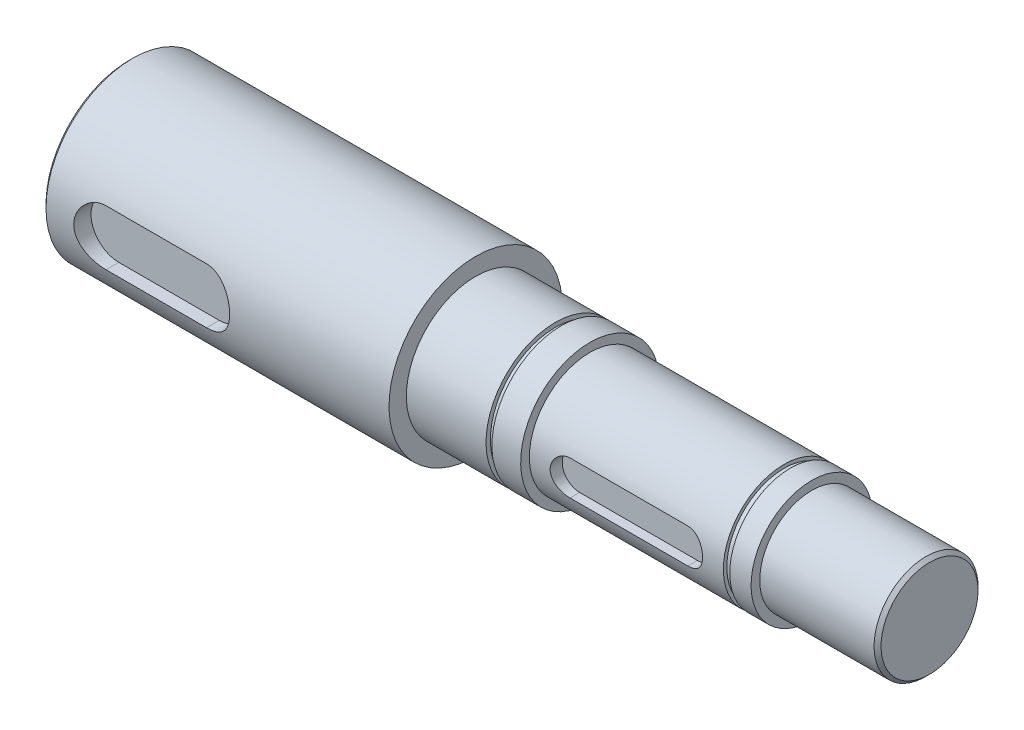
ISO-10303-21;
HEADER;
FILE_DESCRIPTION(('STEP AP214'),'2;1');
FILE_NAME('part.step','',(''),(''),'','','');
FILE_SCHEMA(('AUTOMOTIVE_DESIGN { 1 0 10303 214 1 1 1 1 }'));
ENDSEC;
DATA;
#1=APPLICATION_CONTEXT('core data for automotive mechanical design processes');
#2=APPLICATION_PROTOCOL_DEFINITION('international standard','automotive_design',2000,#1);
#3=PRODUCT_CONTEXT('',#1,'mechanical');
#4=PRODUCT('Part','Part','',(#3));
#5=PRODUCT_RELATED_PRODUCT_CATEGORY('part','',(#4));
#6=PRODUCT_DEFINITION_FORMATION('','',#4);
#7=PRODUCT_DEFINITION_CONTEXT('part definition',#1,'design');
#8=PRODUCT_DEFINITION('design','',#6,#7);
#9=PRODUCT_DEFINITION_SHAPE('','',#8);
#10=(LENGTH_UNIT() NAMED_UNIT(*) SI_UNIT(.MILLI.,.METRE.));
#11=(NAMED_UNIT(*) PLANE_ANGLE_UNIT() SI_UNIT($,.RADIAN.));
#12=(NAMED_UNIT(*) SI_UNIT($,.STERADIAN.) SOLID_ANGLE_UNIT());
#13=UNCERTAINTY_MEASURE_WITH_UNIT(LENGTH_MEASURE(1.E-05),#10,'distance_accuracy_value','');
#14=(GEOMETRIC_REPRESENTATION_CONTEXT(3) GLOBAL_UNCERTAINTY_ASSIGNED_CONTEXT((#13)) GLOBAL_UNIT_ASSIGNED_CONTEXT((#10,
#11,#12)) REPRESENTATION_CONTEXT('',''));
#15=CARTESIAN_POINT('',(0.,0.,0.));
#16=DIRECTION('',(0.,0.,1.));
#17=DIRECTION('',(1.,0.,0.));
#18=AXIS2_PLACEMENT_3D('',#15,#16,#17);
#19=CARTESIAN_POINT('',(231.,0.,0.));
#20=DIRECTION('',(1.,0.,0.));
#21=DIRECTION('',(0.,1.,0.));
#22=AXIS2_PLACEMENT_3D('',#19,#20,#21);
#23=CYLINDRICAL_SURFACE('',#22,17.5);
#24=CARTESIAN_POINT('',(133.,0.,0.));
#25=DIRECTION('',(1.,0.,0.));
#26=DIRECTION('',(0.,1.,0.));
#27=AXIS2_PLACEMENT_3D('',#24,#25,#26);
#28=CIRCLE('',#27,17.5);
#29=CARTESIAN_POINT('',(133.,17.5,0.));
#30=VERTEX_POINT('',#29);
#31=EDGE_CURVE('E188',#30,#30,#28,.T.);
#32=ORIENTED_EDGE('',*,*,#31,.T.);
#33=EDGE_LOOP('',(#32));
#34=FACE_BOUND('',#33,.T.);
#35=CARTESIAN_POINT('',(189.,0.,0.));
#36=DIRECTION('',(1.,0.,0.));
#37=DIRECTION('',(0.,1.,0.));
#38=AXIS2_PLACEMENT_3D('',#35,#36,#37);
#39=CIRCLE('',#38,17.5);
#40=CARTESIAN_POINT('',(189.,17.5,0.));
#41=VERTEX_POINT('',#40);
#42=EDGE_CURVE('E176',#41,#41,#39,.F.);
#43=ORIENTED_EDGE('',*,*,#42,.T.);
#44=EDGE_LOOP('',(#43));
#45=FACE_BOUND('',#44,.T.);
#46=DIRECTION('',(1.,0.,0.));
#47=VECTOR('',#46,1.);
#48=CARTESIAN_POINT('',(231.,-5.,16.7705098312484));
#49=LINE('',#48,#47);
#50=CARTESIAN_POINT('',(178.,-5.,16.7705098312484));
#51=VERTEX_POINT('',#50);
#52=CARTESIAN_POINT('',(144.,-5.,16.7705098312484));
#53=VERTEX_POINT('',#52);
#54=EDGE_CURVE('E58',#51,#53,#49,.F.);
#55=ORIENTED_EDGE('',*,*,#54,.T.);
#56=CARTESIAN_POINT('',(144.,-5.,16.7705098312484));
#57=CARTESIAN_POINT('',(143.862456233053,-5.00001814544053,16.7704912725158));
#58=CARTESIAN_POINT('',(143.724919377977,-4.99432529208164,16.7722013219269));
#59=CARTESIAN_POINT('',(143.450888810716,-4.97165222541634,16.7789431019967));
#60=CARTESIAN_POINT('',(143.314394888157,-4.95467435267923,16.7839741438635));
#61=CARTESIAN_POINT('',(143.043741545981,-4.90961903685605,16.7972068372471));
#62=CARTESIAN_POINT('',(142.909577375167,-4.8815678964473,16.8054009743522));
#63=CARTESIAN_POINT('',(142.644200358011,-4.81461674604718,16.8247046364186));
#64=CARTESIAN_POINT('',(142.512987577578,-4.77571649404059,16.8358142264156));
#65=CARTESIAN_POINT('',(142.254468339378,-4.68740449021954,16.8606149796878));
#66=CARTESIAN_POINT('',(142.127159944636,-4.63799805032665,16.874304837985));
#67=CARTESIAN_POINT('',(141.877200637274,-4.52905522001709,16.9038705765848));
#68=CARTESIAN_POINT('',(141.754551476629,-4.46951506432955,16.9197472690051));
#69=CARTESIAN_POINT('',(141.394791639693,-4.27631278448765,16.9699997678901));
#70=CARTESIAN_POINT('',(141.165701638105,-4.12801150136262,17.007014905076));
#71=CARTESIAN_POINT('',(140.729486035131,-3.79229915782691,17.0850471293107));
#72=CARTESIAN_POINT('',(140.523079725343,-3.60397767000144,17.1261428352533));
#73=CARTESIAN_POINT('',(140.144262306926,-3.19544341696382,17.2070462516998));
#74=CARTESIAN_POINT('',(139.971856835959,-2.97522537348192,17.2468537476932));
#75=CARTESIAN_POINT('',(139.662921908033,-2.50410851659381,17.3215844019062));
#76=CARTESIAN_POINT('',(139.527119075702,-2.25271539483174,17.3564029869974));
#77=CARTESIAN_POINT('',(139.299992287608,-1.72950937060037,17.4163145657262));
#78=CARTESIAN_POINT('',(139.208657694812,-1.45770136944962,17.4414098849257));
#79=CARTESIAN_POINT('',(139.075414299149,-0.908899275051315,17.4784878135792));
#80=CARTESIAN_POINT('',(139.03227814541,-0.632225504452082,17.4907954521753));
#81=CARTESIAN_POINT('',(138.992783305845,-0.0753060921048484,17.5020523750681));
#82=CARTESIAN_POINT('',(138.996416669004,0.204938934421961,17.5010039299558));
#83=CARTESIAN_POINT('',(139.049515480195,0.7524513735302,17.4859002467781));
#84=CARTESIAN_POINT('',(139.097652399274,1.01985970934148,17.4722220494947));
#85=CARTESIAN_POINT('',(139.236240829549,1.5426351469282,17.433846479088));
#86=CARTESIAN_POINT('',(139.326694477011,1.79800164008104,17.4091485496606));
#87=CARTESIAN_POINT('',(139.548266371266,2.29267928834746,17.3509771517082));
#88=CARTESIAN_POINT('',(139.679818952083,2.53178407311226,17.3174105731756));
#89=CARTESIAN_POINT('',(139.979644333576,2.98504901208546,17.245062612945));
#90=CARTESIAN_POINT('',(140.147924587277,3.19920408978385,17.2062801734237));
#91=CARTESIAN_POINT('',(140.427627358825,3.50113424709604,17.1465202223136));
#92=CARTESIAN_POINT('',(140.527363864346,3.60007423743549,17.1259700648702));
#93=CARTESIAN_POINT('',(140.73482024234,3.78923134613089,17.0851123940087));
#94=CARTESIAN_POINT('',(140.84253733987,3.8794514715687,17.0648047990745));
#95=CARTESIAN_POINT('',(141.065345040993,4.05062437518904,17.0249868857383));
#96=CARTESIAN_POINT('',(141.180440529872,4.13157091233146,17.005477109874));
#97=CARTESIAN_POINT('',(141.417160793701,4.28353981460234,16.9678346429649));
#98=CARTESIAN_POINT('',(141.538783003334,4.35456603991597,16.9497014175386));
#99=CARTESIAN_POINT('',(141.788915951318,4.48679157824971,16.9151829895461));
#100=CARTESIAN_POINT('',(141.917478627797,4.54789718496758,16.898814896638));
#101=CARTESIAN_POINT('',(142.17954149636,4.65898872141543,16.8685251216221));
#102=CARTESIAN_POINT('',(142.313039657761,4.70897916633161,16.8546024466244));
#103=CARTESIAN_POINT('',(142.583921011356,4.79739484975373,16.829649854127));
#104=CARTESIAN_POINT('',(142.721299979259,4.835832170633,16.8186169160755));
#105=CARTESIAN_POINT('',(142.998995545652,4.90084834749728,16.7997865631929));
#106=CARTESIAN_POINT('',(143.139310751519,4.92743269748004,16.7919876494692));
#107=CARTESIAN_POINT('',(143.399665114213,4.96528740578586,16.7808301521248));
#108=CARTESIAN_POINT('',(143.519431629728,4.97830600651658,16.776966894118));
#109=CARTESIAN_POINT('',(143.759462294816,4.99566040544727,16.7718034889731));
#110=CARTESIAN_POINT('',(143.879725403777,5.00000944654161,16.7704994326599));
#111=CARTESIAN_POINT('',(144.,5.,16.7705098312484));
#112=B_SPLINE_CURVE_WITH_KNOTS('',3,(#56,#57,#58,#59,#60,#61,#62,#63,#64,#65,#66,#67,#68,#69,
#70,#71,#72,#73,#74,#75,#76,#77,#78,#79,#80,#81,#82,#83,#84,#85,#86,#87,#88,#89,#90,#91,#92,#93,
#94,#95,#96,#97,#98,#99,#100,#101,#102,#103,#104,#105,#106,#107,#108,#109,#110,#111),
.UNSPECIFIED.,.F.,.F.,(4,2,2,2,2,2,2,2,2,2,2,2,2,2,2,2,2,2,2,2,2,2,2,2,2,2,2,4),(0.,
0.41249217880454,0.824898831357961,1.2363317198125,1.64777378699038,2.05900832185037,
2.47039598941261,3.29264569343989,4.13611232627188,4.97971869650209,5.83900986868947,
6.69809539287325,7.53476732988531,8.37129703101928,9.18363381655586,9.99601161556284,
10.8172828992968,11.6387209961027,12.0642579015972,12.489647531354,12.9153217832843,
13.3408299328975,13.7701489130554,14.1992931759112,14.6279870611799,15.056482034464,
15.4177510461265,15.7784677892953),.UNSPECIFIED.);
#113=CARTESIAN_POINT('',(144.,5.,16.7705098312484));
#114=VERTEX_POINT('',#113);
#115=EDGE_CURVE('E12',#53,#114,#112,.T.);
#116=ORIENTED_EDGE('',*,*,#115,.T.);
#117=DIRECTION('',(1.,0.,0.));
#118=VECTOR('',#117,1.);
#119=CARTESIAN_POINT('',(231.,5.,16.7705098312484));
#120=LINE('',#119,#118);
#121=CARTESIAN_POINT('',(178.,5.,16.7705098312484));
#122=VERTEX_POINT('',#121);
#123=EDGE_CURVE('E262',#114,#122,#120,.T.);
#124=ORIENTED_EDGE('',*,*,#123,.T.);
#125=CARTESIAN_POINT('',(178.,5.,16.7705098312484));
#126=CARTESIAN_POINT('',(178.137543766947,5.00001814544053,16.7704912725158));
#127=CARTESIAN_POINT('',(178.275080622023,4.99432529208164,16.7722013219269));
#128=CARTESIAN_POINT('',(178.549111189285,4.97165222541634,16.7789431019967));
#129=CARTESIAN_POINT('',(178.685605111843,4.95467435267923,16.7839741438635));
#130=CARTESIAN_POINT('',(178.95625845402,4.90961903685605,16.7972068372471));
#131=CARTESIAN_POINT('',(179.090422624833,4.88156789644729,16.8054009743522));
#132=CARTESIAN_POINT('',(179.355799641989,4.81461674604718,16.8247046364186));
#133=CARTESIAN_POINT('',(179.487012422422,4.77571649404059,16.8358142264156));
#134=CARTESIAN_POINT('',(179.745531660622,4.68740449021954,16.8606149796878));
#135=CARTESIAN_POINT('',(179.872840055364,4.63799805032665,16.874304837985));
#136=CARTESIAN_POINT('',(180.122799362726,4.52905522001709,16.9038705765848));
#137=CARTESIAN_POINT('',(180.245448523372,4.46951506432955,16.9197472690051));
#138=CARTESIAN_POINT('',(180.605208360307,4.27631278448765,16.9699997678901));
#139=CARTESIAN_POINT('',(180.834298361896,4.12801150136262,17.007014905076));
#140=CARTESIAN_POINT('',(181.270513964869,3.79229915782691,17.0850471293107));
#141=CARTESIAN_POINT('',(181.476920274657,3.60397767000145,17.1261428352533));
#142=CARTESIAN_POINT('',(181.855737693074,3.19544341696383,17.2070462516998));
#143=CARTESIAN_POINT('',(182.028143164041,2.97522537348192,17.2468537476932));
#144=CARTESIAN_POINT('',(182.337078091968,2.5041085165938,17.3215844019062));
#145=CARTESIAN_POINT('',(182.472880924299,2.25271539483174,17.3564029869975));
#146=CARTESIAN_POINT('',(182.700007712392,1.72950937060037,17.4163145657262));
#147=CARTESIAN_POINT('',(182.791342305188,1.45770136944962,17.4414098849257));
#148=CARTESIAN_POINT('',(182.924585700851,0.908899275051315,17.4784878135792));
#149=CARTESIAN_POINT('',(182.96772185459,0.632225504452082,17.4907954521753));
#150=CARTESIAN_POINT('',(183.007216694155,0.075306092104849,17.5020523750681));
#151=CARTESIAN_POINT('',(183.003583330996,-0.20493893442196,17.5010039299558));
#152=CARTESIAN_POINT('',(182.950484519806,-0.752451373530199,17.4859002467781));
#153=CARTESIAN_POINT('',(182.902347600726,-1.01985970934148,17.4722220494947));
#154=CARTESIAN_POINT('',(182.763759170452,-1.5426351469282,17.433846479088));
#155=CARTESIAN_POINT('',(182.67330552299,-1.79800164008104,17.4091485496606));
#156=CARTESIAN_POINT('',(182.451733628734,-2.29267928834746,17.3509771517082));
#157=CARTESIAN_POINT('',(182.320181047918,-2.53178407311225,17.3174105731756));
#158=CARTESIAN_POINT('',(182.020355666425,-2.98504901208545,17.245062612945));
#159=CARTESIAN_POINT('',(181.852075412724,-3.19920408978385,17.2062801734237));
#160=CARTESIAN_POINT('',(181.572372641176,-3.50113424709604,17.1465202223136));
#161=CARTESIAN_POINT('',(181.472636135654,-3.60007423743549,17.1259700648702));
#162=CARTESIAN_POINT('',(181.26517975766,-3.78923134613089,17.0851123940087));
#163=CARTESIAN_POINT('',(181.15746266013,-3.87945147156871,17.0648047990745));
#164=CARTESIAN_POINT('',(180.934654959007,-4.05062437518905,17.0249868857383));
#165=CARTESIAN_POINT('',(180.819559470128,-4.13157091233146,17.005477109874));
#166=CARTESIAN_POINT('',(180.582839206299,-4.28353981460233,16.9678346429649));
#167=CARTESIAN_POINT('',(180.461216996666,-4.35456603991597,16.9497014175386));
#168=CARTESIAN_POINT('',(180.211084048682,-4.48679157824972,16.9151829895461));
#169=CARTESIAN_POINT('',(180.082521372203,-4.54789718496759,16.898814896638));
#170=CARTESIAN_POINT('',(179.82045850364,-4.65898872141544,16.8685251216221));
#171=CARTESIAN_POINT('',(179.686960342239,-4.70897916633162,16.8546024466244));
#172=CARTESIAN_POINT('',(179.416078988644,-4.79739484975373,16.829649854127));
#173=CARTESIAN_POINT('',(179.278700020741,-4.835832170633,16.8186169160755));
#174=CARTESIAN_POINT('',(179.001004454348,-4.90084834749728,16.7997865631929));
#175=CARTESIAN_POINT('',(178.860689248481,-4.92743269748004,16.7919876494692));
#176=CARTESIAN_POINT('',(178.600334885788,-4.96528740578587,16.7808301521248));
#177=CARTESIAN_POINT('',(178.480568370272,-4.97830600651658,16.776966894118));
#178=CARTESIAN_POINT('',(178.240537705184,-4.99566040544728,16.7718034889731));
#179=CARTESIAN_POINT('',(178.120274596223,-5.00000944654161,16.7704994326599));
#180=CARTESIAN_POINT('',(178.,-5.,16.7705098312484));
#181=B_SPLINE_CURVE_WITH_KNOTS('',3,(#125,#126,#127,#128,#129,#130,#131,#132,#133,#134,#135,
#136,#137,#138,#139,#140,#141,#142,#143,#144,#145,#146,#147,#148,#149,#150,#151,#152,#153,#154,
#155,#156,#157,#158,#159,#160,#161,#162,#163,#164,#165,#166,#167,#168,#169,#170,#171,#172,#173,
#174,#175,#176,#177,#178,#179,#180),.UNSPECIFIED.,.F.,.F.,(4,2,2,2,2,2,2,2,2,2,2,2,2,2,2,2,2,2,
2,2,2,2,2,2,2,2,2,4),(0.,0.412492178804568,0.824898831357989,1.23633171981253,1.64777378699038,
2.05900832185037,2.47039598941261,3.29264569343989,4.13611232627187,4.97971869650209,
5.83900986868947,6.69809539287325,7.53476732988531,8.37129703101928,9.18363381655586,
9.99601161556284,10.8172828992967,11.6387209961027,12.0642579015972,12.489647531354,
12.9153217832843,13.3408299328975,13.7701489130554,14.1992931759112,14.6279870611799,
15.056482034464,15.4177510461265,15.7784677892953),.UNSPECIFIED.);
#182=EDGE_CURVE('E265',#122,#51,#181,.T.);
#183=ORIENTED_EDGE('',*,*,#182,.T.);
#184=EDGE_LOOP('',(#55,#116,#124,#183));
#185=FACE_BOUND('',#184,.T.);
#186=ADVANCED_FACE('F43',(#34,#45,#185),#23,.T.);
#187=CARTESIAN_POINT('',(231.,0.,0.));
#188=DIRECTION('',(1.,0.,0.));
#189=DIRECTION('',(0.,1.,0.));
#190=AXIS2_PLACEMENT_3D('',#187,#188,#189);
#191=CYLINDRICAL_SURFACE('',#190,25.);
#192=CARTESIAN_POINT('',(1.,0.,0.));
#193=DIRECTION('',(-1.,0.,0.));
#194=DIRECTION('',(0.,-1.,0.));
#195=AXIS2_PLACEMENT_3D('',#192,#193,#194);
#196=CIRCLE('',#195,25.);
#197=CARTESIAN_POINT('',(1.,-25.,0.));
#198=VERTEX_POINT('',#197);
#199=EDGE_CURVE('E200',#198,#198,#196,.F.);
#200=ORIENTED_EDGE('',*,*,#199,.T.);
#201=EDGE_LOOP('',(#200));
#202=FACE_BOUND('',#201,.T.);
#203=CARTESIAN_POINT('',(100.,0.,0.));
#204=DIRECTION('',(1.,0.,0.));
#205=DIRECTION('',(0.,1.,0.));
#206=AXIS2_PLACEMENT_3D('',#203,#204,#205);
#207=CIRCLE('',#206,25.);
#208=CARTESIAN_POINT('',(100.,25.,0.));
#209=VERTEX_POINT('',#208);
#210=EDGE_CURVE('E197',#209,#209,#207,.T.);
#211=ORIENTED_EDGE('',*,*,#210,.F.);
#212=EDGE_LOOP('',(#211));
#213=FACE_BOUND('',#212,.T.);
#214=DIRECTION('',(1.,0.,0.));
#215=VECTOR('',#214,1.);
#216=CARTESIAN_POINT('',(231.,8.,23.685438564654));
#217=LINE('',#216,#215);
#218=CARTESIAN_POINT('',(17.,8.,23.685438564654));
#219=VERTEX_POINT('',#218);
#220=CARTESIAN_POINT('',(46.,7.99999999999999,23.685438564654));
#221=VERTEX_POINT('',#220);
#222=EDGE_CURVE('E259',#219,#221,#217,.T.);
#223=ORIENTED_EDGE('',*,*,#222,.T.);
#224=CARTESIAN_POINT('',(46.,8.,23.685438564654));
#225=CARTESIAN_POINT('',(46.218795539162,8.0000305009868,23.6854045017699));
#226=CARTESIAN_POINT('',(46.4375784175901,7.99102549590207,23.688469123957));
#227=CARTESIAN_POINT('',(46.8734584831461,7.95517098834654,23.7005466659397));
#228=CARTESIAN_POINT('',(47.0905560797659,7.92832596730078,23.7095580918898));
#229=CARTESIAN_POINT('',(47.5209180700088,7.85711678617779,23.7332474487131));
#230=CARTESIAN_POINT('',(47.7341914372507,7.81280150402691,23.7479095676547));
#231=CARTESIAN_POINT('',(48.156025231161,7.70706364591999,23.7824363785492));
#232=CARTESIAN_POINT('',(48.3645855069398,7.64564052309331,23.8023012368121));
#233=CARTESIAN_POINT('',(48.7754306308973,7.50626477359767,23.8466207436467));
#234=CARTESIAN_POINT('',(48.9777198595615,7.42832399741401,23.871072100227));
#235=CARTESIAN_POINT('',(49.3749573542057,7.25648080977818,23.9238701821779));
#236=CARTESIAN_POINT('',(49.5699028602967,7.16257246913871,23.9522183537893));
#237=CARTESIAN_POINT('',(49.9512127188175,6.9594960920567,24.0120097704205));
#238=CARTESIAN_POINT('',(50.1375757832142,6.85032577498936,24.0434534778038));
#239=CARTESIAN_POINT('',(50.5006602918151,6.61744603477566,24.1085882492257));
#240=CARTESIAN_POINT('',(50.6773782438757,6.49373139612585,24.1422801175567));
#241=CARTESIAN_POINT('',(51.0256325986393,6.22836076648435,24.2121239184413));
#242=CARTESIAN_POINT('',(51.1968168331965,6.08625407883805,24.2483201681044));
#243=CARTESIAN_POINT('',(51.5267130516151,5.78833672714892,24.3211568024613));
#244=CARTESIAN_POINT('',(51.6854248130941,5.6325258188669,24.3577971950608));
#245=CARTESIAN_POINT('',(51.9894414972978,5.30810929270467,24.4305467351509));
#246=CARTESIAN_POINT('',(52.1347417407466,5.13949924631991,24.4666556935584));
#247=CARTESIAN_POINT('',(52.4108811662342,4.79062390909333,24.5373508174071));
#248=CARTESIAN_POINT('',(52.5417253747909,4.61036270425929,24.571937509624));
#249=CARTESIAN_POINT('',(52.7911067782064,4.23472722433445,24.6394880403333));
#250=CARTESIAN_POINT('',(52.9092679746819,4.03909225448966,24.6723920777703));
#251=CARTESIAN_POINT('',(53.1285809303382,3.63806855716319,24.7347045975399));
#252=CARTESIAN_POINT('',(53.2297389430681,3.43268345145265,24.764114363848));
#253=CARTESIAN_POINT('',(53.4142534832096,3.01351588007871,24.8186095857731));
#254=CARTESIAN_POINT('',(53.4976106399432,2.79973371159709,24.8436951942581));
#255=CARTESIAN_POINT('',(53.6457786275789,2.3653182235479,24.8888116650216));
#256=CARTESIAN_POINT('',(53.7105901870623,2.14468517350128,24.9088427258691));
#257=CARTESIAN_POINT('',(53.8192705220839,1.70544225179378,24.9427025935344));
#258=CARTESIAN_POINT('',(53.8637471662537,1.48699651153127,24.9567105519711));
#259=CARTESIAN_POINT('',(53.9343382460007,1.04687351423021,24.9790431991589));
#260=CARTESIAN_POINT('',(53.9604533538181,0.825196375800789,24.987368095974));
#261=CARTESIAN_POINT('',(53.9940664724529,0.380331357109013,24.9980968202581));
#262=CARTESIAN_POINT('',(54.0015677704998,0.157143750579833,25.0005016932125));
#263=CARTESIAN_POINT('',(53.9978884177329,-0.289059181581599,24.9993242896769));
#264=CARTESIAN_POINT('',(53.9867081618934,-0.512074510756486,24.9957421397673));
#265=CARTESIAN_POINT('',(53.9465240781012,-0.948122721994496,24.982932199242));
#266=CARTESIAN_POINT('',(53.918184152377,-1.16122337440047,24.9739147546529));
#267=CARTESIAN_POINT('',(53.8445055714175,-1.5842479286718,24.9506522172205));
#268=CARTESIAN_POINT('',(53.7991612547153,-1.79417074826053,24.9364053833303));
#269=CARTESIAN_POINT('',(53.6918858435822,-2.20926025571511,24.9030623126186));
#270=CARTESIAN_POINT('',(53.6299602872914,-2.41442850679349,24.883967695069));
#271=CARTESIAN_POINT('',(53.4900005454034,-2.8188099194413,24.8414102882546));
#272=CARTESIAN_POINT('',(53.4119602892948,-3.01802080436251,24.8179458531793));
#273=CARTESIAN_POINT('',(53.2393438759578,-3.41154318330595,24.7669380612143));
#274=CARTESIAN_POINT('',(53.1445775213702,-3.60576520425745,24.7393484159813));
#275=CARTESIAN_POINT('',(52.9398473002552,-3.98560999732482,24.6810018717145));
#276=CARTESIAN_POINT('',(52.8298782267942,-4.17122979396889,24.6502438884484));
#277=CARTESIAN_POINT('',(52.5955258992301,-4.53270747909882,24.5863428737413));
#278=CARTESIAN_POINT('',(52.471142139346,-4.7085650247274,24.5531997586266));
#279=CARTESIAN_POINT('',(52.2087683555239,-5.04950188641516,24.4853578278308));
#280=CARTESIAN_POINT('',(52.0707778772517,-5.21458084226651,24.4506589602235));
#281=CARTESIAN_POINT('',(51.7757186660706,-5.53998133884013,24.3790394135533));
#282=CARTESIAN_POINT('',(51.6180796112611,-5.69977939936891,24.3420879194303));
#283=CARTESIAN_POINT('',(51.2899580506973,-6.00554906117101,24.2684591422018));
#284=CARTESIAN_POINT('',(51.1194796287876,-6.15152502579989,24.2317817759498));
#285=CARTESIAN_POINT('',(50.7665715934411,-6.42885617891019,24.1596845061705));
#286=CARTESIAN_POINT('',(50.5841339157041,-6.56020133712787,24.124265476498));
#287=CARTESIAN_POINT('',(50.2086200944304,-6.80720218507682,24.0557358007469));
#288=CARTESIAN_POINT('',(50.0155481375019,-6.92286398797542,24.0226242577006));
#289=CARTESIAN_POINT('',(49.6173089688444,-7.13912382113364,23.9592525423358));
#290=CARTESIAN_POINT('',(49.4120156716435,-7.23950267807823,23.929035814194));
#291=CARTESIAN_POINT('',(48.9931767305922,-7.42247230148351,23.8729148751205));
#292=CARTESIAN_POINT('',(48.7796345405165,-7.50507041945903,23.8470088829081));
#293=CARTESIAN_POINT('',(48.3459770294644,-7.65171374146477,23.8003613895494));
#294=CARTESIAN_POINT('',(48.1258690323962,-7.71577882321283,23.7796143585091));
#295=CARTESIAN_POINT('',(47.6806086982161,-7.82483658602114,23.7439510877628));
#296=CARTESIAN_POINT('',(47.4554587236219,-7.86983801069008,23.7290321752161));
#297=CARTESIAN_POINT('',(47.0255217489757,-7.93665798185134,23.7067632378289));
#298=CARTESIAN_POINT('',(46.8210652886768,-7.96040759697896,23.698785219734));
#299=CARTESIAN_POINT('',(46.4110777238327,-7.99207883674137,23.6881135732448));
#300=CARTESIAN_POINT('',(46.2055484834027,-8.00002217927726,23.6854126941265));
#301=CARTESIAN_POINT('',(46.,-8.,23.685438564654));
#302=B_SPLINE_CURVE_WITH_KNOTS('',3,(#224,#225,#226,#227,#228,#229,#230,#231,#232,#233,#234,
#235,#236,#237,#238,#239,#240,#241,#242,#243,#244,#245,#246,#247,#248,#249,#250,#251,#252,#253,
#254,#255,#256,#257,#258,#259,#260,#261,#262,#263,#264,#265,#266,#267,#268,#269,#270,#271,#272,
#273,#274,#275,#276,#277,#278,#279,#280,#281,#282,#283,#284,#285,#286,#287,#288,#289,#290,#291,
#292,#293,#294,#295,#296,#297,#298,#299,#300,#301),.UNSPECIFIED.,.F.,.F.,(4,2,2,2,2,2,2,2,2,2,2,
2,2,2,2,2,2,2,2,2,2,2,2,2,2,2,2,2,2,2,2,2,2,2,2,2,2,2,4),(0.,0.656160353985757,1.3121559422847,
1.96632907877123,2.62052312901079,3.27424941125305,3.92821897194336,4.58228636115631,
5.23658901442488,5.9120428276018,6.58750868128337,7.26320932101097,7.93867426802346,
8.63054127837651,9.32215326962852,10.0137408059466,10.705301168864,11.3745639939787,
12.0438023152132,12.7129224394405,13.3820284169931,14.0267677786013,14.6717219915366,
15.3164610576552,15.9614434456781,16.6142979195937,17.2673765528145,17.920478108135,
18.5736014781847,19.2552776237621,19.9367378555117,20.6186624291756,21.3003204287233,
21.9909830333727,22.6813595301151,23.3709927905347,24.0603094050433,24.6775982031612,
25.2940382559757),.UNSPECIFIED.);
#303=CARTESIAN_POINT('',(46.,-8.,23.685438564654));
#304=VERTEX_POINT('',#303);
#305=EDGE_CURVE('E73',#221,#304,#302,.T.);
#306=ORIENTED_EDGE('',*,*,#305,.T.);
#307=DIRECTION('',(1.,0.,0.));
#308=VECTOR('',#307,1.);
#309=CARTESIAN_POINT('',(231.,-8.,23.685438564654));
#310=LINE('',#309,#308);
#311=CARTESIAN_POINT('',(17.,-8.,23.685438564654));
#312=VERTEX_POINT('',#311);
#313=EDGE_CURVE('E227',#304,#312,#310,.F.);
#314=ORIENTED_EDGE('',*,*,#313,.T.);
#315=CARTESIAN_POINT('',(17.,-8.,23.685438564654));
#316=CARTESIAN_POINT('',(16.781204460838,-8.0000305009868,23.6854045017699));
#317=CARTESIAN_POINT('',(16.5624215824099,-7.99102549590207,23.688469123957));
#318=CARTESIAN_POINT('',(16.1265415168539,-7.95517098834654,23.7005466659397));
#319=CARTESIAN_POINT('',(15.9094439202341,-7.92832596730078,23.7095580918898));
#320=CARTESIAN_POINT('',(15.4790819299912,-7.85711678617779,23.7332474487131));
#321=CARTESIAN_POINT('',(15.2658085627493,-7.81280150402691,23.7479095676547));
#322=CARTESIAN_POINT('',(14.843974768839,-7.70706364591999,23.7824363785492));
#323=CARTESIAN_POINT('',(14.6354144930602,-7.64564052309331,23.8023012368121));
#324=CARTESIAN_POINT('',(14.2245693691027,-7.50626477359767,23.8466207436467));
#325=CARTESIAN_POINT('',(14.0222801404385,-7.42832399741401,23.871072100227));
#326=CARTESIAN_POINT('',(13.6250426457943,-7.25648080977818,23.9238701821779));
#327=CARTESIAN_POINT('',(13.4300971397033,-7.16257246913871,23.9522183537893));
#328=CARTESIAN_POINT('',(13.0487872811825,-6.9594960920567,24.0120097704205));
#329=CARTESIAN_POINT('',(12.8624242167857,-6.85032577498935,24.0434534778038));
#330=CARTESIAN_POINT('',(12.4993397081849,-6.61744603477566,24.1085882492257));
#331=CARTESIAN_POINT('',(12.3226217561243,-6.49373139612585,24.1422801175567));
#332=CARTESIAN_POINT('',(11.9743674013607,-6.22836076648434,24.2121239184413));
#333=CARTESIAN_POINT('',(11.8031831668034,-6.08625407883805,24.2483201681044));
#334=CARTESIAN_POINT('',(11.4732869483849,-5.78833672714892,24.3211568024613));
#335=CARTESIAN_POINT('',(11.3145751869059,-5.6325258188669,24.3577971950608));
#336=CARTESIAN_POINT('',(11.0105585027022,-5.30810929270467,24.4305467351509));
#337=CARTESIAN_POINT('',(10.8652582592534,-5.13949924631991,24.4666556935584));
#338=CARTESIAN_POINT('',(10.5891188337658,-4.79062390909333,24.5373508174071));
#339=CARTESIAN_POINT('',(10.4582746252091,-4.61036270425929,24.5719375096239));
#340=CARTESIAN_POINT('',(10.2088932217936,-4.23472722433445,24.6394880403333));
#341=CARTESIAN_POINT('',(10.0907320253181,-4.03909225448966,24.6723920777703));
#342=CARTESIAN_POINT('',(9.87141906966182,-3.63806855716319,24.7347045975399));
#343=CARTESIAN_POINT('',(9.77026105693185,-3.43268345145265,24.764114363848));
#344=CARTESIAN_POINT('',(9.58574651679038,-3.01351588007871,24.8186095857731));
#345=CARTESIAN_POINT('',(9.50238936005683,-2.79973371159709,24.8436951942581));
#346=CARTESIAN_POINT('',(9.35422137242115,-2.3653182235479,24.8888116650216));
#347=CARTESIAN_POINT('',(9.2894098129377,-2.14468517350128,24.9088427258691));
#348=CARTESIAN_POINT('',(9.18072947791608,-1.70544225179378,24.9427025935344));
#349=CARTESIAN_POINT('',(9.13625283374629,-1.48699651153126,24.9567105519711));
#350=CARTESIAN_POINT('',(9.06566175399934,-1.0468735142302,24.9790431991589));
#351=CARTESIAN_POINT('',(9.03954664618187,-0.825196375800787,24.987368095974));
#352=CARTESIAN_POINT('',(9.00593352754705,-0.38033135710901,24.9980968202581));
#353=CARTESIAN_POINT('',(8.99843222950016,-0.15714375057983,25.0005016932125));
#354=CARTESIAN_POINT('',(9.00211158226705,0.289059181581603,24.9993242896769));
#355=CARTESIAN_POINT('',(9.0132918381066,0.51207451075649,24.9957421397673));
#356=CARTESIAN_POINT('',(9.0534759218988,0.9481227219945,24.982932199242));
#357=CARTESIAN_POINT('',(9.08181584762303,1.16122337440048,24.9739147546529));
#358=CARTESIAN_POINT('',(9.15549442858252,1.58424792867181,24.9506522172205));
#359=CARTESIAN_POINT('',(9.20083874528467,1.79417074826054,24.9364053833303));
#360=CARTESIAN_POINT('',(9.30811415641775,2.20926025571512,24.9030623126186));
#361=CARTESIAN_POINT('',(9.37003971270861,2.41442850679349,24.883967695069));
#362=CARTESIAN_POINT('',(9.50999945459665,2.81880991944131,24.8414102882546));
#363=CARTESIAN_POINT('',(9.58803971070517,3.01802080436252,24.8179458531793));
#364=CARTESIAN_POINT('',(9.76065612404218,3.41154318330595,24.7669380612143));
#365=CARTESIAN_POINT('',(9.85542247862979,3.60576520425745,24.7393484159813));
#366=CARTESIAN_POINT('',(10.0601526997448,3.98560999732482,24.6810018717145));
#367=CARTESIAN_POINT('',(10.1701217732058,4.17122979396889,24.6502438884484));
#368=CARTESIAN_POINT('',(10.4044741007699,4.53270747909883,24.5863428737413));
#369=CARTESIAN_POINT('',(10.528857860654,4.7085650247274,24.5531997586266));
#370=CARTESIAN_POINT('',(10.7912316444761,5.04950188641516,24.4853578278308));
#371=CARTESIAN_POINT('',(10.9292221227483,5.21458084226652,24.4506589602235));
#372=CARTESIAN_POINT('',(11.2242813339294,5.53998133884013,24.3790394135533));
#373=CARTESIAN_POINT('',(11.381920388739,5.69977939936891,24.3420879194303));
#374=CARTESIAN_POINT('',(11.7100419493027,6.00554906117101,24.2684591422018));
#375=CARTESIAN_POINT('',(11.8805203712124,6.15152502579989,24.2317817759498));
#376=CARTESIAN_POINT('',(12.2334284065589,6.42885617891019,24.1596845061705));
#377=CARTESIAN_POINT('',(12.4158660842959,6.56020133712788,24.124265476498));
#378=CARTESIAN_POINT('',(12.7913799055696,6.80720218507683,24.0557358007469));
#379=CARTESIAN_POINT('',(12.9844518624981,6.92286398797542,24.0226242577006));
#380=CARTESIAN_POINT('',(13.3826910311556,7.13912382113364,23.9592525423358));
#381=CARTESIAN_POINT('',(13.5879843283565,7.23950267807823,23.929035814194));
#382=CARTESIAN_POINT('',(14.0068232694078,7.42247230148351,23.8729148751205));
#383=CARTESIAN_POINT('',(14.2203654594835,7.50507041945903,23.8470088829081));
#384=CARTESIAN_POINT('',(14.6540229705356,7.65171374146477,23.8003613895494));
#385=CARTESIAN_POINT('',(14.8741309676038,7.71577882321283,23.7796143585091));
#386=CARTESIAN_POINT('',(15.3193913017839,7.82483658602114,23.7439510877628));
#387=CARTESIAN_POINT('',(15.5445412763781,7.86983801069008,23.7290321752161));
#388=CARTESIAN_POINT('',(15.9744782510243,7.93665798185134,23.7067632378289));
#389=CARTESIAN_POINT('',(16.1789347113232,7.96040759697896,23.698785219734));
#390=CARTESIAN_POINT('',(16.5889222761673,7.99207883674137,23.6881135732448));
#391=CARTESIAN_POINT('',(16.7944515165973,8.00002217927726,23.6854126941265));
#392=CARTESIAN_POINT('',(17.,8.,23.685438564654));
#393=B_SPLINE_CURVE_WITH_KNOTS('',3,(#315,#316,#317,#318,#319,#320,#321,#322,#323,#324,#325,
#326,#327,#328,#329,#330,#331,#332,#333,#334,#335,#336,#337,#338,#339,#340,#341,#342,#343,#344,
#345,#346,#347,#348,#349,#350,#351,#352,#353,#354,#355,#356,#357,#358,#359,#360,#361,#362,#363,
#364,#365,#366,#367,#368,#369,#370,#371,#372,#373,#374,#375,#376,#377,#378,#379,#380,#381,#382,
#383,#384,#385,#386,#387,#388,#389,#390,#391,#392),.UNSPECIFIED.,.F.,.F.,(4,2,2,2,2,2,2,2,2,2,2,
2,2,2,2,2,2,2,2,2,2,2,2,2,2,2,2,2,2,2,2,2,2,2,2,2,2,2,4),(0.,0.656160353985757,1.3121559422847,
1.96632907877124,2.6205231290108,3.27424941125305,3.92821897194338,4.58228636115631,
5.23658901442489,5.91204282760181,6.58750868128337,7.26320932101097,7.93867426802346,
8.63054127837651,9.32215326962852,10.0137408059466,10.705301168864,11.3745639939787,
12.0438023152132,12.7129224394405,13.3820284169931,14.0267677786013,14.6717219915366,
15.3164610576552,15.9614434456781,16.6142979195937,17.2673765528145,17.920478108135,
18.5736014781847,19.2552776237621,19.9367378555117,20.6186624291756,21.3003204287233,
21.9909830333727,22.6813595301151,23.3709927905347,24.0603094050433,24.6775982031612,
25.2940382559757),.UNSPECIFIED.);
#394=EDGE_CURVE('E252',#312,#219,#393,.T.);
#395=ORIENTED_EDGE('',*,*,#394,.T.);
#396=EDGE_LOOP('',(#223,#306,#314,#395));
#397=FACE_BOUND('',#396,.T.);
#398=ADVANCED_FACE('F229',(#202,#213,#397),#191,.T.);
#399=CARTESIAN_POINT('',(231.,0.,0.));
#400=DIRECTION('',(1.,0.,0.));
#401=DIRECTION('',(0.,1.,0.));
#402=AXIS2_PLACEMENT_3D('',#399,#400,#401);
#403=CYLINDRICAL_SURFACE('',#402,20.);
#404=CARTESIAN_POINT('',(124.7,0.,0.));
#405=DIRECTION('',(1.,0.,0.));
#406=DIRECTION('',(0.,1.,0.));
#407=AXIS2_PLACEMENT_3D('',#404,#405,#406);
#408=CIRCLE('',#407,20.);
#409=CARTESIAN_POINT('',(124.7,20.,0.));
#410=VERTEX_POINT('',#409);
#411=EDGE_CURVE('E180',#410,#410,#408,.F.);
#412=ORIENTED_EDGE('',*,*,#411,.F.);
#413=EDGE_LOOP('',(#412));
#414=FACE_BOUND('',#413,.T.);
#415=CARTESIAN_POINT('',(133.,0.,0.));
#416=DIRECTION('',(1.,0.,0.));
#417=DIRECTION('',(0.,1.,0.));
#418=AXIS2_PLACEMENT_3D('',#415,#416,#417);
#419=CIRCLE('',#418,20.);
#420=CARTESIAN_POINT('',(133.,20.,0.));
#421=VERTEX_POINT('',#420);
#422=EDGE_CURVE('E191',#421,#421,#419,.T.);
#423=ORIENTED_EDGE('',*,*,#422,.F.);
#424=EDGE_LOOP('',(#423));
#425=FACE_BOUND('',#424,.T.);
#426=ADVANCED_FACE('F299',(#414,#425),#403,.T.);
#427=CARTESIAN_POINT('',(133.,20.,0.));
#428=DIRECTION('',(1.,0.,0.));
#429=DIRECTION('',(0.,1.,0.));
#430=AXIS2_PLACEMENT_3D('',#427,#428,#429);
#431=PLANE('',#430);
#432=ORIENTED_EDGE('',*,*,#422,.T.);
#433=EDGE_LOOP('',(#432));
#434=FACE_BOUND('',#433,.T.);
#435=ORIENTED_EDGE('',*,*,#31,.F.);
#436=EDGE_LOOP('',(#435));
#437=FACE_BOUND('',#436,.T.);
#438=ADVANCED_FACE('F343',(#434,#437),#431,.T.);
#439=CARTESIAN_POINT('',(190.85,0.,0.));
#440=DIRECTION('',(1.,0.,0.));
#441=DIRECTION('',(0.,1.,0.));
#442=AXIS2_PLACEMENT_3D('',#439,#440,#441);
#443=PLANE('',#442);
#444=CARTESIAN_POINT('',(190.85,0.,0.));
#445=DIRECTION('',(1.,0.,0.));
#446=DIRECTION('',(0.,1.,0.));
#447=AXIS2_PLACEMENT_3D('',#444,#445,#446);
#448=CIRCLE('',#447,17.5);
#449=CARTESIAN_POINT('',(190.85,17.5,0.));
#450=VERTEX_POINT('',#449);
#451=EDGE_CURVE('E185',#450,#450,#448,.F.);
#452=ORIENTED_EDGE('',*,*,#451,.T.);
#453=EDGE_LOOP('',(#452));
#454=FACE_BOUND('',#453,.T.);
#455=CARTESIAN_POINT('',(190.85,0.,0.));
#456=DIRECTION('',(1.,0.,0.));
#457=DIRECTION('',(0.,1.,0.));
#458=AXIS2_PLACEMENT_3D('',#455,#456,#457);
#459=CIRCLE('',#458,16.5);
#460=CARTESIAN_POINT('',(190.85,16.5,0.));
#461=VERTEX_POINT('',#460);
#462=EDGE_CURVE('E173',#461,#461,#459,.T.);
#463=ORIENTED_EDGE('',*,*,#462,.T.);
#464=EDGE_LOOP('',(#463));
#465=FACE_BOUND('',#464,.T.);
#466=ADVANCED_FACE('F339',(#454,#465),#443,.F.);
#467=CARTESIAN_POINT('',(189.,0.,0.));
#468=DIRECTION('',(1.,0.,0.));
#469=DIRECTION('',(0.,1.,0.));
#470=AXIS2_PLACEMENT_3D('',#467,#468,#469);
#471=PLANE('',#470);
#472=ORIENTED_EDGE('',*,*,#42,.F.);
#473=EDGE_LOOP('',(#472));
#474=FACE_BOUND('',#473,.T.);
#475=CARTESIAN_POINT('',(189.,0.,0.));
#476=DIRECTION('',(1.,0.,0.));
#477=DIRECTION('',(0.,1.,0.));
#478=AXIS2_PLACEMENT_3D('',#475,#476,#477);
#479=CIRCLE('',#478,16.5);
#480=CARTESIAN_POINT('',(189.,16.5,0.));
#481=VERTEX_POINT('',#480);
#482=EDGE_CURVE('E177',#481,#481,#479,.T.);
#483=ORIENTED_EDGE('',*,*,#482,.F.);
#484=EDGE_LOOP('',(#483));
#485=FACE_BOUND('',#484,.T.);
#486=ADVANCED_FACE('F336',(#474,#485),#471,.T.);
#487=CARTESIAN_POINT('',(190.85,0.,0.));
#488=DIRECTION('',(-1.,0.,0.));
#489=DIRECTION('',(0.,-1.,0.));
#490=AXIS2_PLACEMENT_3D('',#487,#488,#489);
#491=CYLINDRICAL_SURFACE('',#490,16.5);
#492=ORIENTED_EDGE('',*,*,#462,.F.);
#493=EDGE_LOOP('',(#492));
#494=FACE_BOUND('',#493,.T.);
#495=ORIENTED_EDGE('',*,*,#482,.T.);
#496=EDGE_LOOP('',(#495));
#497=FACE_BOUND('',#496,.T.);
#498=ADVANCED_FACE('F334',(#494,#497),#491,.T.);
#499=CARTESIAN_POINT('',(231.,15.,0.));
#500=DIRECTION('',(1.,0.,0.));
#501=DIRECTION('',(0.,1.,0.));
#502=AXIS2_PLACEMENT_3D('',#499,#500,#501);
#503=PLANE('',#502);
#504=CARTESIAN_POINT('',(231.,0.,0.));
#505=DIRECTION('',(1.,0.,0.));
#506=DIRECTION('',(0.,1.,0.));
#507=AXIS2_PLACEMENT_3D('',#504,#505,#506);
#508=CIRCLE('',#507,14.);
#509=CARTESIAN_POINT('',(231.,14.,0.));
#510=VERTEX_POINT('',#509);
#511=EDGE_CURVE('E206',#510,#510,#508,.T.);
#512=ORIENTED_EDGE('',*,*,#511,.T.);
#513=EDGE_LOOP('',(#512));
#514=FACE_BOUND('',#513,.T.);
#515=ADVANCED_FACE('F330',(#514),#503,.T.);
#516=CARTESIAN_POINT('',(231.,0.,0.));
#517=DIRECTION('',(-1.,0.,0.));
#518=DIRECTION('',(0.,-1.,0.));
#519=AXIS2_PLACEMENT_3D('',#516,#517,#518);
#520=CONICAL_SURFACE('',#519,14.,0.785398163397448);
#521=CARTESIAN_POINT('',(230.,0.,0.));
#522=DIRECTION('',(1.,0.,0.));
#523=DIRECTION('',(0.,1.,0.));
#524=AXIS2_PLACEMENT_3D('',#521,#522,#523);
#525=CIRCLE('',#524,15.);
#526=CARTESIAN_POINT('',(230.,15.,0.));
#527=VERTEX_POINT('',#526);
#528=EDGE_CURVE('E209',#527,#527,#525,.F.);
#529=ORIENTED_EDGE('',*,*,#528,.F.);
#530=EDGE_LOOP('',(#529));
#531=FACE_BOUND('',#530,.T.);
#532=ORIENTED_EDGE('',*,*,#511,.F.);
#533=EDGE_LOOP('',(#532));
#534=FACE_BOUND('',#533,.T.);
#535=ADVANCED_FACE('F46',(#531,#534),#520,.T.);
#536=CARTESIAN_POINT('',(231.,0.,0.));
#537=DIRECTION('',(1.,0.,0.));
#538=DIRECTION('',(0.,1.,0.));
#539=AXIS2_PLACEMENT_3D('',#536,#537,#538);
#540=CYLINDRICAL_SURFACE('',#539,15.);
#541=ORIENTED_EDGE('',*,*,#528,.T.);
#542=EDGE_LOOP('',(#541));
#543=FACE_BOUND('',#542,.T.);
#544=CARTESIAN_POINT('',(197.,0.,0.));
#545=DIRECTION('',(1.,0.,0.));
#546=DIRECTION('',(0.,1.,0.));
#547=AXIS2_PLACEMENT_3D('',#544,#545,#546);
#548=CIRCLE('',#547,15.);
#549=CARTESIAN_POINT('',(197.,15.,0.));
#550=VERTEX_POINT('',#549);
#551=EDGE_CURVE('E181',#550,#550,#548,.T.);
#552=ORIENTED_EDGE('',*,*,#551,.T.);
#553=EDGE_LOOP('',(#552));
#554=FACE_BOUND('',#553,.T.);
#555=ADVANCED_FACE('F314',(#543,#554),#540,.T.);
#556=CARTESIAN_POINT('',(197.,17.5,0.));
#557=DIRECTION('',(1.,0.,0.));
#558=DIRECTION('',(0.,1.,0.));
#559=AXIS2_PLACEMENT_3D('',#556,#557,#558);
#560=PLANE('',#559);
#561=CARTESIAN_POINT('',(197.,0.,0.));
#562=DIRECTION('',(1.,0.,0.));
#563=DIRECTION('',(0.,1.,0.));
#564=AXIS2_PLACEMENT_3D('',#561,#562,#563);
#565=CIRCLE('',#564,17.5);
#566=CARTESIAN_POINT('',(197.,17.5,0.));
#567=VERTEX_POINT('',#566);
#568=EDGE_CURVE('E184',#567,#567,#565,.T.);
#569=ORIENTED_EDGE('',*,*,#568,.T.);
#570=EDGE_LOOP('',(#569));
#571=FACE_BOUND('',#570,.T.);
#572=ORIENTED_EDGE('',*,*,#551,.F.);
#573=EDGE_LOOP('',(#572));
#574=FACE_BOUND('',#573,.T.);
#575=ADVANCED_FACE('F304',(#571,#574),#560,.T.);
#576=ORIENTED_EDGE('',*,*,#451,.F.);
#577=EDGE_LOOP('',(#576));
#578=FACE_BOUND('',#577,.T.);
#579=ORIENTED_EDGE('',*,*,#568,.F.);
#580=EDGE_LOOP('',(#579));
#581=FACE_BOUND('',#580,.T.);
#582=ADVANCED_FACE('F272',(#578,#581),#23,.T.);
#583=CARTESIAN_POINT('',(124.7,0.,0.));
#584=DIRECTION('',(1.,0.,0.));
#585=DIRECTION('',(0.,1.,0.));
#586=AXIS2_PLACEMENT_3D('',#583,#584,#585);
#587=PLANE('',#586);
#588=ORIENTED_EDGE('',*,*,#411,.T.);
#589=EDGE_LOOP('',(#588));
#590=FACE_BOUND('',#589,.T.);
#591=CARTESIAN_POINT('',(124.7,0.,0.));
#592=DIRECTION('',(1.,0.,0.));
#593=DIRECTION('',(0.,1.,0.));
#594=AXIS2_PLACEMENT_3D('',#591,#592,#593);
#595=CIRCLE('',#594,18.75);
#596=CARTESIAN_POINT('',(124.7,18.75,0.));
#597=VERTEX_POINT('',#596);
#598=EDGE_CURVE('E167',#597,#597,#595,.T.);
#599=ORIENTED_EDGE('',*,*,#598,.T.);
#600=EDGE_LOOP('',(#599));
#601=FACE_BOUND('',#600,.T.);
#602=ADVANCED_FACE('F303',(#590,#601),#587,.F.);
#603=CARTESIAN_POINT('',(123.,0.,0.));
#604=DIRECTION('',(1.,0.,0.));
#605=DIRECTION('',(0.,1.,0.));
#606=AXIS2_PLACEMENT_3D('',#603,#604,#605);
#607=PLANE('',#606);
#608=CARTESIAN_POINT('',(123.,0.,0.));
#609=DIRECTION('',(1.,0.,0.));
#610=DIRECTION('',(0.,1.,0.));
#611=AXIS2_PLACEMENT_3D('',#608,#609,#610);
#612=CIRCLE('',#611,20.);
#613=CARTESIAN_POINT('',(123.,20.,0.));
#614=VERTEX_POINT('',#613);
#615=EDGE_CURVE('E170',#614,#614,#612,.F.);
#616=ORIENTED_EDGE('',*,*,#615,.F.);
#617=EDGE_LOOP('',(#616));
#618=FACE_BOUND('',#617,.T.);
#619=CARTESIAN_POINT('',(123.,0.,0.));
#620=DIRECTION('',(1.,0.,0.));
#621=DIRECTION('',(0.,1.,0.));
#622=AXIS2_PLACEMENT_3D('',#619,#620,#621);
#623=CIRCLE('',#622,18.75);
#624=CARTESIAN_POINT('',(123.,18.75,0.));
#625=VERTEX_POINT('',#624);
#626=EDGE_CURVE('E166',#625,#625,#623,.T.);
#627=ORIENTED_EDGE('',*,*,#626,.F.);
#628=EDGE_LOOP('',(#627));
#629=FACE_BOUND('',#628,.T.);
#630=ADVANCED_FACE('F311',(#618,#629),#607,.T.);
#631=CARTESIAN_POINT('',(124.7,0.,0.));
#632=DIRECTION('',(-1.,0.,0.));
#633=DIRECTION('',(0.,-1.,0.));
#634=AXIS2_PLACEMENT_3D('',#631,#632,#633);
#635=CYLINDRICAL_SURFACE('',#634,18.75);
#636=ORIENTED_EDGE('',*,*,#598,.F.);
#637=EDGE_LOOP('',(#636));
#638=FACE_BOUND('',#637,.T.);
#639=ORIENTED_EDGE('',*,*,#626,.T.);
#640=EDGE_LOOP('',(#639));
#641=FACE_BOUND('',#640,.T.);
#642=ADVANCED_FACE('F250',(#638,#641),#635,.T.);
#643=CARTESIAN_POINT('',(0.,0.,0.));
#644=DIRECTION('',(-1.,0.,0.));
#645=DIRECTION('',(0.,-1.,0.));
#646=AXIS2_PLACEMENT_3D('',#643,#644,#645);
#647=PLANE('',#646);
#648=CARTESIAN_POINT('',(0.,0.,0.));
#649=DIRECTION('',(-1.,0.,0.));
#650=DIRECTION('',(0.,-1.,0.));
#651=AXIS2_PLACEMENT_3D('',#648,#649,#650);
#652=CIRCLE('',#651,24.);
#653=CARTESIAN_POINT('',(0.,-24.,0.));
#654=VERTEX_POINT('',#653);
#655=EDGE_CURVE('E203',#654,#654,#652,.T.);
#656=ORIENTED_EDGE('',*,*,#655,.T.);
#657=EDGE_LOOP('',(#656));
#658=FACE_BOUND('',#657,.T.);
#659=ADVANCED_FACE('F352',(#658),#647,.T.);
#660=CARTESIAN_POINT('',(1.,0.,0.));
#661=DIRECTION('',(1.,0.,0.));
#662=DIRECTION('',(0.,1.,0.));
#663=AXIS2_PLACEMENT_3D('',#660,#661,#662);
#664=CONICAL_SURFACE('',#663,25.,0.785398163397454);
#665=ORIENTED_EDGE('',*,*,#655,.F.);
#666=EDGE_LOOP('',(#665));
#667=FACE_BOUND('',#666,.T.);
#668=ORIENTED_EDGE('',*,*,#199,.F.);
#669=EDGE_LOOP('',(#668));
#670=FACE_BOUND('',#669,.T.);
#671=ADVANCED_FACE('F366',(#667,#670),#664,.T.);
#672=CARTESIAN_POINT('',(100.,25.,0.));
#673=DIRECTION('',(1.,0.,0.));
#674=DIRECTION('',(0.,1.,0.));
#675=AXIS2_PLACEMENT_3D('',#672,#673,#674);
#676=PLANE('',#675);
#677=ORIENTED_EDGE('',*,*,#210,.T.);
#678=EDGE_LOOP('',(#677));
#679=FACE_BOUND('',#678,.T.);
#680=CARTESIAN_POINT('',(100.,0.,0.));
#681=DIRECTION('',(1.,0.,0.));
#682=DIRECTION('',(0.,1.,0.));
#683=AXIS2_PLACEMENT_3D('',#680,#681,#682);
#684=CIRCLE('',#683,20.);
#685=CARTESIAN_POINT('',(100.,20.,0.));
#686=VERTEX_POINT('',#685);
#687=EDGE_CURVE('E194',#686,#686,#684,.T.);
#688=ORIENTED_EDGE('',*,*,#687,.F.);
#689=EDGE_LOOP('',(#688));
#690=FACE_BOUND('',#689,.T.);
#691=ADVANCED_FACE('F360',(#679,#690),#676,.T.);
#692=ORIENTED_EDGE('',*,*,#687,.T.);
#693=EDGE_LOOP('',(#692));
#694=FACE_BOUND('',#693,.T.);
#695=ORIENTED_EDGE('',*,*,#615,.T.);
#696=EDGE_LOOP('',(#695));
#697=FACE_BOUND('',#696,.T.);
#698=ADVANCED_FACE('F248',(#694,#697),#403,.T.);
#699=CARTESIAN_POINT('',(17.,0.,25.));
#700=DIRECTION('',(0.,0.,-1.));
#701=DIRECTION('',(-1.,0.,0.));
#702=AXIS2_PLACEMENT_3D('',#699,#700,#701);
#703=CYLINDRICAL_SURFACE('',#702,8.);
#704=DIRECTION('',(0.,0.,-1.));
#705=VECTOR('',#704,1.);
#706=CARTESIAN_POINT('',(17.,-8.,25.));
#707=LINE('',#706,#705);
#708=CARTESIAN_POINT('',(17.,-8.,20.));
#709=VERTEX_POINT('',#708);
#710=EDGE_CURVE('E164',#312,#709,#707,.T.);
#711=ORIENTED_EDGE('',*,*,#710,.T.);
#712=CARTESIAN_POINT('',(17.,0.,20.));
#713=DIRECTION('',(0.,0.,1.));
#714=DIRECTION('',(1.,0.,0.));
#715=AXIS2_PLACEMENT_3D('',#712,#713,#714);
#716=CIRCLE('',#715,8.);
#717=CARTESIAN_POINT('',(17.,8.,20.));
#718=VERTEX_POINT('',#717);
#719=EDGE_CURVE('E124',#718,#709,#716,.T.);
#720=ORIENTED_EDGE('',*,*,#719,.F.);
#721=DIRECTION('',(0.,0.,-1.));
#722=VECTOR('',#721,1.);
#723=CARTESIAN_POINT('',(17.,8.,25.));
#724=LINE('',#723,#722);
#725=EDGE_CURVE('E158',#219,#718,#724,.T.);
#726=ORIENTED_EDGE('',*,*,#725,.F.);
#727=ORIENTED_EDGE('',*,*,#394,.F.);
#728=EDGE_LOOP('',(#711,#720,#726,#727));
#729=FACE_BOUND('',#728,.T.);
#730=ADVANCED_FACE('F243',(#729),#703,.F.);
#731=CARTESIAN_POINT('',(17.,-8.,25.));
#732=DIRECTION('',(0.,1.,0.));
#733=DIRECTION('',(0.,0.,1.));
#734=AXIS2_PLACEMENT_3D('',#731,#732,#733);
#735=PLANE('',#734);
#736=DIRECTION('',(0.,0.,-1.));
#737=VECTOR('',#736,1.);
#738=CARTESIAN_POINT('',(46.,-8.,25.));
#739=LINE('',#738,#737);
#740=CARTESIAN_POINT('',(46.,-8.,20.));
#741=VERTEX_POINT('',#740);
#742=EDGE_CURVE('E162',#304,#741,#739,.T.);
#743=ORIENTED_EDGE('',*,*,#742,.T.);
#744=DIRECTION('',(1.,0.,0.));
#745=VECTOR('',#744,1.);
#746=CARTESIAN_POINT('',(17.,-8.,20.));
#747=LINE('',#746,#745);
#748=EDGE_CURVE('E149',#709,#741,#747,.T.);
#749=ORIENTED_EDGE('',*,*,#748,.F.);
#750=ORIENTED_EDGE('',*,*,#710,.F.);
#751=ORIENTED_EDGE('',*,*,#313,.F.);
#752=EDGE_LOOP('',(#743,#749,#750,#751));
#753=FACE_BOUND('',#752,.T.);
#754=ADVANCED_FACE('F239',(#753),#735,.T.);
#755=CARTESIAN_POINT('',(46.,0.,25.));
#756=DIRECTION('',(0.,0.,-1.));
#757=DIRECTION('',(-1.,0.,0.));
#758=AXIS2_PLACEMENT_3D('',#755,#756,#757);
#759=CYLINDRICAL_SURFACE('',#758,8.);
#760=DIRECTION('',(0.,0.,-1.));
#761=VECTOR('',#760,1.);
#762=CARTESIAN_POINT('',(46.,8.,25.));
#763=LINE('',#762,#761);
#764=CARTESIAN_POINT('',(46.,8.,20.));
#765=VERTEX_POINT('',#764);
#766=EDGE_CURVE('E160',#221,#765,#763,.T.);
#767=ORIENTED_EDGE('',*,*,#766,.T.);
#768=CARTESIAN_POINT('',(46.,0.,20.));
#769=DIRECTION('',(0.,0.,1.));
#770=DIRECTION('',(1.,0.,0.));
#771=AXIS2_PLACEMENT_3D('',#768,#769,#770);
#772=CIRCLE('',#771,8.);
#773=EDGE_CURVE('E152',#741,#765,#772,.T.);
#774=ORIENTED_EDGE('',*,*,#773,.F.);
#775=ORIENTED_EDGE('',*,*,#742,.F.);
#776=ORIENTED_EDGE('',*,*,#305,.F.);
#777=EDGE_LOOP('',(#767,#774,#775,#776));
#778=FACE_BOUND('',#777,.T.);
#779=ADVANCED_FACE('F233',(#778),#759,.F.);
#780=CARTESIAN_POINT('',(17.,8.,25.));
#781=DIRECTION('',(0.,-1.,0.));
#782=DIRECTION('',(0.,0.,-1.));
#783=AXIS2_PLACEMENT_3D('',#780,#781,#782);
#784=PLANE('',#783);
#785=ORIENTED_EDGE('',*,*,#725,.T.);
#786=DIRECTION('',(-1.,0.,0.));
#787=VECTOR('',#786,1.);
#788=CARTESIAN_POINT('',(17.,8.,20.));
#789=LINE('',#788,#787);
#790=EDGE_CURVE('E155',#765,#718,#789,.T.);
#791=ORIENTED_EDGE('',*,*,#790,.F.);
#792=ORIENTED_EDGE('',*,*,#766,.F.);
#793=ORIENTED_EDGE('',*,*,#222,.F.);
#794=EDGE_LOOP('',(#785,#791,#792,#793));
#795=FACE_BOUND('',#794,.T.);
#796=ADVANCED_FACE('F238',(#795),#784,.T.);
#797=CARTESIAN_POINT('',(17.,0.,20.));
#798=DIRECTION('',(0.,0.,1.));
#799=DIRECTION('',(1.,0.,0.));
#800=AXIS2_PLACEMENT_3D('',#797,#798,#799);
#801=PLANE('',#800);
#802=ORIENTED_EDGE('',*,*,#719,.T.);
#803=ORIENTED_EDGE('',*,*,#748,.T.);
#804=ORIENTED_EDGE('',*,*,#773,.T.);
#805=ORIENTED_EDGE('',*,*,#790,.T.);
#806=EDGE_LOOP('',(#802,#803,#804,#805));
#807=FACE_BOUND('',#806,.T.);
#808=ADVANCED_FACE('F287',(#807),#801,.T.);
#809=CARTESIAN_POINT('',(144.,0.,25.));
#810=DIRECTION('',(0.,0.,-1.));
#811=DIRECTION('',(-1.,0.,0.));
#812=AXIS2_PLACEMENT_3D('',#809,#810,#811);
#813=CYLINDRICAL_SURFACE('',#812,5.);
#814=DIRECTION('',(0.,0.,-1.));
#815=VECTOR('',#814,1.);
#816=CARTESIAN_POINT('',(144.,-5.,25.));
#817=LINE('',#816,#815);
#818=CARTESIAN_POINT('',(144.,-5.,14.));
#819=VERTEX_POINT('',#818);
#820=EDGE_CURVE('E116',#53,#819,#817,.T.);
#821=ORIENTED_EDGE('',*,*,#820,.T.);
#822=CARTESIAN_POINT('',(144.,0.,14.));
#823=DIRECTION('',(0.,0.,1.));
#824=DIRECTION('',(1.,0.,0.));
#825=AXIS2_PLACEMENT_3D('',#822,#823,#824);
#826=CIRCLE('',#825,5.);
#827=CARTESIAN_POINT('',(144.,5.,14.));
#828=VERTEX_POINT('',#827);
#829=EDGE_CURVE('E121',#828,#819,#826,.T.);
#830=ORIENTED_EDGE('',*,*,#829,.F.);
#831=DIRECTION('',(0.,0.,-1.));
#832=VECTOR('',#831,1.);
#833=CARTESIAN_POINT('',(144.,5.,25.));
#834=LINE('',#833,#832);
#835=EDGE_CURVE('E143',#114,#828,#834,.T.);
#836=ORIENTED_EDGE('',*,*,#835,.F.);
#837=ORIENTED_EDGE('',*,*,#115,.F.);
#838=EDGE_LOOP('',(#821,#830,#836,#837));
#839=FACE_BOUND('',#838,.T.);
#840=ADVANCED_FACE('F118',(#839),#813,.F.);
#841=CARTESIAN_POINT('',(144.,-5.,25.));
#842=DIRECTION('',(0.,1.,0.));
#843=DIRECTION('',(0.,0.,1.));
#844=AXIS2_PLACEMENT_3D('',#841,#842,#843);
#845=PLANE('',#844);
#846=DIRECTION('',(0.,0.,-1.));
#847=VECTOR('',#846,1.);
#848=CARTESIAN_POINT('',(178.,-5.,25.));
#849=LINE('',#848,#847);
#850=CARTESIAN_POINT('',(178.,-5.,14.));
#851=VERTEX_POINT('',#850);
#852=EDGE_CURVE('E125',#51,#851,#849,.T.);
#853=ORIENTED_EDGE('',*,*,#852,.T.);
#854=DIRECTION('',(1.,0.,0.));
#855=VECTOR('',#854,1.);
#856=CARTESIAN_POINT('',(144.,-5.,14.));
#857=LINE('',#856,#855);
#858=EDGE_CURVE('E128',#819,#851,#857,.T.);
#859=ORIENTED_EDGE('',*,*,#858,.F.);
#860=ORIENTED_EDGE('',*,*,#820,.F.);
#861=ORIENTED_EDGE('',*,*,#54,.F.);
#862=EDGE_LOOP('',(#853,#859,#860,#861));
#863=FACE_BOUND('',#862,.T.);
#864=ADVANCED_FACE('F129',(#863),#845,.T.);
#865=CARTESIAN_POINT('',(178.,0.,25.));
#866=DIRECTION('',(0.,0.,-1.));
#867=DIRECTION('',(-1.,0.,0.));
#868=AXIS2_PLACEMENT_3D('',#865,#866,#867);
#869=CYLINDRICAL_SURFACE('',#868,5.);
#870=DIRECTION('',(0.,0.,-1.));
#871=VECTOR('',#870,1.);
#872=CARTESIAN_POINT('',(178.,5.,25.));
#873=LINE('',#872,#871);
#874=CARTESIAN_POINT('',(178.,5.,14.));
#875=VERTEX_POINT('',#874);
#876=EDGE_CURVE('E65',#122,#875,#873,.T.);
#877=ORIENTED_EDGE('',*,*,#876,.T.);
#878=CARTESIAN_POINT('',(178.,0.,14.));
#879=DIRECTION('',(0.,0.,1.));
#880=DIRECTION('',(1.,0.,0.));
#881=AXIS2_PLACEMENT_3D('',#878,#879,#880);
#882=CIRCLE('',#881,5.);
#883=EDGE_CURVE('E134',#851,#875,#882,.T.);
#884=ORIENTED_EDGE('',*,*,#883,.F.);
#885=ORIENTED_EDGE('',*,*,#852,.F.);
#886=ORIENTED_EDGE('',*,*,#182,.F.);
#887=EDGE_LOOP('',(#877,#884,#885,#886));
#888=FACE_BOUND('',#887,.T.);
#889=ADVANCED_FACE('F276',(#888),#869,.F.);
#890=CARTESIAN_POINT('',(144.,5.,25.));
#891=DIRECTION('',(0.,-1.,0.));
#892=DIRECTION('',(0.,0.,-1.));
#893=AXIS2_PLACEMENT_3D('',#890,#891,#892);
#894=PLANE('',#893);
#895=ORIENTED_EDGE('',*,*,#835,.T.);
#896=DIRECTION('',(-1.,0.,0.));
#897=VECTOR('',#896,1.);
#898=CARTESIAN_POINT('',(144.,5.,14.));
#899=LINE('',#898,#897);
#900=EDGE_CURVE('E138',#875,#828,#899,.T.);
#901=ORIENTED_EDGE('',*,*,#900,.F.);
#902=ORIENTED_EDGE('',*,*,#876,.F.);
#903=ORIENTED_EDGE('',*,*,#123,.F.);
#904=EDGE_LOOP('',(#895,#901,#902,#903));
#905=FACE_BOUND('',#904,.T.);
#906=ADVANCED_FACE('F281',(#905),#894,.T.);
#907=CARTESIAN_POINT('',(144.,0.,14.));
#908=DIRECTION('',(0.,0.,1.));
#909=DIRECTION('',(1.,0.,0.));
#910=AXIS2_PLACEMENT_3D('',#907,#908,#909);
#911=PLANE('',#910);
#912=ORIENTED_EDGE('',*,*,#829,.T.);
#913=ORIENTED_EDGE('',*,*,#858,.T.);
#914=ORIENTED_EDGE('',*,*,#883,.T.);
#915=ORIENTED_EDGE('',*,*,#900,.T.);
#916=EDGE_LOOP('',(#912,#913,#914,#915));
#917=FACE_BOUND('',#916,.T.);
#918=ADVANCED_FACE('F137',(#917),#911,.T.);
#919=CLOSED_SHELL('',(#186,#398,#426,#438,#466,#486,#498,#515,#535,#555,#575,#582,#602,#630,
#642,#659,#671,#691,#698,#730,#754,#779,#796,#808,#840,#864,#889,#906,#918));
#920=MANIFOLD_SOLID_BREP('B2',#919);
#921=ADVANCED_BREP_SHAPE_REPRESENTATION('',(#18,#920),#14);
#922=SHAPE_DEFINITION_REPRESENTATION(#9,#921);
ENDSEC;
END-ISO-10303-21;
